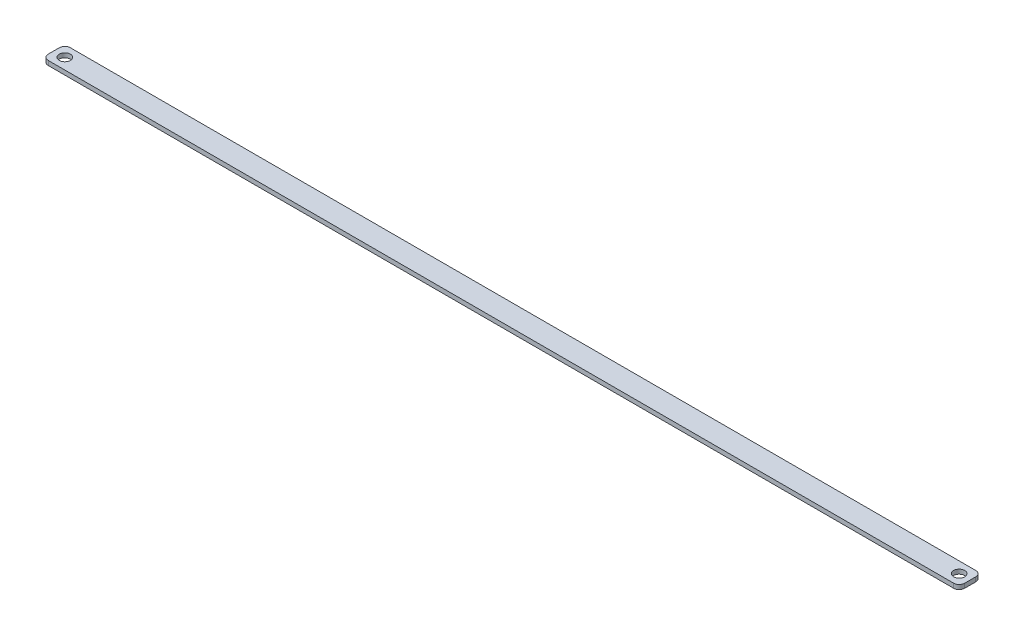
ISO-10303-21;
HEADER;
FILE_DESCRIPTION(('STEP AP214'),'2;1');
FILE_NAME('part.step','',(''),(''),'','','');
FILE_SCHEMA(('AUTOMOTIVE_DESIGN { 1 0 10303 214 1 1 1 1 }'));
ENDSEC;
DATA;
#1=APPLICATION_CONTEXT('core data for automotive mechanical design processes');
#2=APPLICATION_PROTOCOL_DEFINITION('international standard','automotive_design',2000,#1);
#3=PRODUCT_CONTEXT('',#1,'mechanical');
#4=PRODUCT('Part','Part','',(#3));
#5=PRODUCT_RELATED_PRODUCT_CATEGORY('part','',(#4));
#6=PRODUCT_DEFINITION_FORMATION('','',#4);
#7=PRODUCT_DEFINITION_CONTEXT('part definition',#1,'design');
#8=PRODUCT_DEFINITION('design','',#6,#7);
#9=PRODUCT_DEFINITION_SHAPE('','',#8);
#10=(LENGTH_UNIT() NAMED_UNIT(*) SI_UNIT(.MILLI.,.METRE.));
#11=(NAMED_UNIT(*) PLANE_ANGLE_UNIT() SI_UNIT($,.RADIAN.));
#12=(NAMED_UNIT(*) SI_UNIT($,.STERADIAN.) SOLID_ANGLE_UNIT());
#13=UNCERTAINTY_MEASURE_WITH_UNIT(LENGTH_MEASURE(1.E-05),#10,'distance_accuracy_value','');
#14=(GEOMETRIC_REPRESENTATION_CONTEXT(3) GLOBAL_UNCERTAINTY_ASSIGNED_CONTEXT((#13)) GLOBAL_UNIT_ASSIGNED_CONTEXT((#10,
#11,#12)) REPRESENTATION_CONTEXT('',''));
#15=CARTESIAN_POINT('',(0.,0.,0.));
#16=DIRECTION('',(0.,0.,1.));
#17=DIRECTION('',(1.,0.,0.));
#18=AXIS2_PLACEMENT_3D('',#15,#16,#17);
#19=CARTESIAN_POINT('',(231.907336066959,2.,-5.));
#20=DIRECTION('',(0.,-1.,0.));
#21=DIRECTION('',(0.,0.,-1.));
#22=AXIS2_PLACEMENT_3D('',#19,#20,#21);
#23=CYLINDRICAL_SURFACE('',#22,2.5);
#24=CARTESIAN_POINT('',(231.907336066959,0.,-5.));
#25=DIRECTION('',(0.,1.,0.));
#26=DIRECTION('',(0.,0.,1.));
#27=AXIS2_PLACEMENT_3D('',#24,#25,#26);
#28=CIRCLE('',#27,2.5);
#29=CARTESIAN_POINT('',(231.907336066959,0.,-2.5));
#30=VERTEX_POINT('',#29);
#31=EDGE_CURVE('E220',#30,#30,#28,.T.);
#32=ORIENTED_EDGE('',*,*,#31,.F.);
#33=EDGE_LOOP('',(#32));
#34=FACE_BOUND('',#33,.T.);
#35=CARTESIAN_POINT('',(231.907336066959,2.,-5.));
#36=DIRECTION('',(0.,1.,0.));
#37=DIRECTION('',(0.,0.,1.));
#38=AXIS2_PLACEMENT_3D('',#35,#36,#37);
#39=CIRCLE('',#38,2.5);
#40=CARTESIAN_POINT('',(231.907336066959,2.,-2.5));
#41=VERTEX_POINT('',#40);
#42=EDGE_CURVE('E13',#41,#41,#39,.T.);
#43=ORIENTED_EDGE('',*,*,#42,.T.);
#44=EDGE_LOOP('',(#43));
#45=FACE_BOUND('',#44,.T.);
#46=ADVANCED_FACE('F93',(#34,#45),#23,.F.);
#47=CARTESIAN_POINT('',(-173.092663933041,2.,-5.));
#48=DIRECTION('',(0.,-1.,0.));
#49=DIRECTION('',(0.,0.,-1.));
#50=AXIS2_PLACEMENT_3D('',#47,#48,#49);
#51=CYLINDRICAL_SURFACE('',#50,2.5);
#52=CARTESIAN_POINT('',(-173.092663933041,0.,-5.));
#53=DIRECTION('',(0.,1.,0.));
#54=DIRECTION('',(0.,0.,1.));
#55=AXIS2_PLACEMENT_3D('',#52,#53,#54);
#56=CIRCLE('',#55,2.5);
#57=CARTESIAN_POINT('',(-173.092663933041,0.,-2.5));
#58=VERTEX_POINT('',#57);
#59=EDGE_CURVE('E233',#58,#58,#56,.T.);
#60=ORIENTED_EDGE('',*,*,#59,.F.);
#61=EDGE_LOOP('',(#60));
#62=FACE_BOUND('',#61,.T.);
#63=CARTESIAN_POINT('',(-173.092663933041,2.,-5.));
#64=DIRECTION('',(0.,1.,0.));
#65=DIRECTION('',(0.,0.,1.));
#66=AXIS2_PLACEMENT_3D('',#63,#64,#65);
#67=CIRCLE('',#66,2.5);
#68=CARTESIAN_POINT('',(-173.092663933041,2.,-2.5));
#69=VERTEX_POINT('',#68);
#70=EDGE_CURVE('E103',#69,#69,#67,.T.);
#71=ORIENTED_EDGE('',*,*,#70,.T.);
#72=EDGE_LOOP('',(#71));
#73=FACE_BOUND('',#72,.T.);
#74=ADVANCED_FACE('F254',(#62,#73),#51,.F.);
#75=CARTESIAN_POINT('',(47.5,2.,-2.5));
#76=DIRECTION('',(0.,1.,0.));
#77=DIRECTION('',(0.,0.,1.));
#78=AXIS2_PLACEMENT_3D('',#75,#76,#77);
#79=PLANE('',#78);
#80=DIRECTION('',(1.,0.,0.));
#81=VECTOR('',#80,1.);
#82=CARTESIAN_POINT('',(-175.592663933041,2.,0.));
#83=LINE('',#82,#81);
#84=CARTESIAN_POINT('',(-175.592663933041,2.,0.));
#85=VERTEX_POINT('',#84);
#86=CARTESIAN_POINT('',(234.407336066959,2.,0.));
#87=VERTEX_POINT('',#86);
#88=EDGE_CURVE('E156',#85,#87,#83,.T.);
#89=ORIENTED_EDGE('',*,*,#88,.T.);
#90=CARTESIAN_POINT('',(234.407336066959,2.,-2.5));
#91=DIRECTION('',(0.,1.,0.));
#92=DIRECTION('',(0.,0.,1.));
#93=AXIS2_PLACEMENT_3D('',#90,#91,#92);
#94=CIRCLE('',#93,2.5);
#95=CARTESIAN_POINT('',(236.907336066959,2.,-2.50000000000002));
#96=VERTEX_POINT('',#95);
#97=EDGE_CURVE('E162',#87,#96,#94,.T.);
#98=ORIENTED_EDGE('',*,*,#97,.T.);
#99=DIRECTION('',(0.,0.,-1.));
#100=VECTOR('',#99,1.);
#101=CARTESIAN_POINT('',(236.907336066959,2.,-2.50000000000002));
#102=LINE('',#101,#100);
#103=CARTESIAN_POINT('',(236.907336066959,2.,-7.49999999999998));
#104=VERTEX_POINT('',#103);
#105=EDGE_CURVE('E184',#96,#104,#102,.T.);
#106=ORIENTED_EDGE('',*,*,#105,.T.);
#107=CARTESIAN_POINT('',(234.407336066959,2.,-7.5));
#108=DIRECTION('',(0.,1.,0.));
#109=DIRECTION('',(0.,0.,-1.));
#110=AXIS2_PLACEMENT_3D('',#107,#108,#109);
#111=CIRCLE('',#110,2.5);
#112=CARTESIAN_POINT('',(234.407336066959,2.,-10.));
#113=VERTEX_POINT('',#112);
#114=EDGE_CURVE('E188',#104,#113,#111,.T.);
#115=ORIENTED_EDGE('',*,*,#114,.T.);
#116=DIRECTION('',(-1.,0.,0.));
#117=VECTOR('',#116,1.);
#118=CARTESIAN_POINT('',(189.407336066959,2.,-10.));
#119=LINE('',#118,#117);
#120=CARTESIAN_POINT('',(-175.592663933041,2.,-10.));
#121=VERTEX_POINT('',#120);
#122=EDGE_CURVE('E242',#113,#121,#119,.T.);
#123=ORIENTED_EDGE('',*,*,#122,.T.);
#124=CARTESIAN_POINT('',(-175.592663933041,2.,-7.5));
#125=DIRECTION('',(0.,1.,0.));
#126=DIRECTION('',(0.,0.,-1.));
#127=AXIS2_PLACEMENT_3D('',#124,#125,#126);
#128=CIRCLE('',#127,2.5);
#129=CARTESIAN_POINT('',(-178.092663933041,2.,-7.49999999999998));
#130=VERTEX_POINT('',#129);
#131=EDGE_CURVE('E168',#121,#130,#128,.T.);
#132=ORIENTED_EDGE('',*,*,#131,.T.);
#133=DIRECTION('',(0.,0.,1.));
#134=VECTOR('',#133,1.);
#135=CARTESIAN_POINT('',(-178.092663933041,2.,-2.50000000000002));
#136=LINE('',#135,#134);
#137=CARTESIAN_POINT('',(-178.092663933041,2.,-2.50000000000002));
#138=VERTEX_POINT('',#137);
#139=EDGE_CURVE('E186',#130,#138,#136,.T.);
#140=ORIENTED_EDGE('',*,*,#139,.T.);
#141=CARTESIAN_POINT('',(-175.592663933041,2.,-2.5));
#142=DIRECTION('',(0.,1.,0.));
#143=DIRECTION('',(0.,0.,-1.));
#144=AXIS2_PLACEMENT_3D('',#141,#142,#143);
#145=CIRCLE('',#144,2.5);
#146=EDGE_CURVE('E165',#138,#85,#145,.T.);
#147=ORIENTED_EDGE('',*,*,#146,.T.);
#148=EDGE_LOOP('',(#89,#98,#106,#115,#123,#132,#140,#147));
#149=FACE_BOUND('',#148,.T.);
#150=ORIENTED_EDGE('',*,*,#42,.F.);
#151=EDGE_LOOP('',(#150));
#152=FACE_BOUND('',#151,.T.);
#153=ORIENTED_EDGE('',*,*,#70,.F.);
#154=EDGE_LOOP('',(#153));
#155=FACE_BOUND('',#154,.T.);
#156=ADVANCED_FACE('F158',(#149,#152,#155),#79,.T.);
#157=CARTESIAN_POINT('',(234.407336066959,0.,-2.5));
#158=DIRECTION('',(0.,1.,0.));
#159=DIRECTION('',(0.,0.,1.));
#160=AXIS2_PLACEMENT_3D('',#157,#158,#159);
#161=PLANE('',#160);
#162=ORIENTED_EDGE('',*,*,#31,.T.);
#163=EDGE_LOOP('',(#162));
#164=FACE_BOUND('',#163,.T.);
#165=CARTESIAN_POINT('',(234.407336066959,0.,-2.5));
#166=DIRECTION('',(0.,1.,0.));
#167=DIRECTION('',(0.,0.,1.));
#168=AXIS2_PLACEMENT_3D('',#165,#166,#167);
#169=CIRCLE('',#168,2.5);
#170=CARTESIAN_POINT('',(234.407336066959,0.,0.));
#171=VERTEX_POINT('',#170);
#172=CARTESIAN_POINT('',(236.907336066959,0.,-2.50000000000002));
#173=VERTEX_POINT('',#172);
#174=EDGE_CURVE('E177',#171,#173,#169,.T.);
#175=ORIENTED_EDGE('',*,*,#174,.F.);
#176=DIRECTION('',(1.,0.,0.));
#177=VECTOR('',#176,1.);
#178=CARTESIAN_POINT('',(-175.592663933041,0.,0.));
#179=LINE('',#178,#177);
#180=CARTESIAN_POINT('',(-175.592663933041,0.,0.));
#181=VERTEX_POINT('',#180);
#182=EDGE_CURVE('E173',#181,#171,#179,.T.);
#183=ORIENTED_EDGE('',*,*,#182,.F.);
#184=CARTESIAN_POINT('',(-175.592663933041,0.,-2.5));
#185=DIRECTION('',(0.,1.,0.));
#186=DIRECTION('',(0.,0.,-1.));
#187=AXIS2_PLACEMENT_3D('',#184,#185,#186);
#188=CIRCLE('',#187,2.5);
#189=CARTESIAN_POINT('',(-178.092663933041,0.,-2.50000000000002));
#190=VERTEX_POINT('',#189);
#191=EDGE_CURVE('E199',#190,#181,#188,.T.);
#192=ORIENTED_EDGE('',*,*,#191,.F.);
#193=DIRECTION('',(0.,0.,1.));
#194=VECTOR('',#193,1.);
#195=CARTESIAN_POINT('',(-178.092663933041,0.,-2.50000000000002));
#196=LINE('',#195,#194);
#197=CARTESIAN_POINT('',(-178.092663933041,0.,-7.49999999999998));
#198=VERTEX_POINT('',#197);
#199=EDGE_CURVE('E206',#198,#190,#196,.T.);
#200=ORIENTED_EDGE('',*,*,#199,.F.);
#201=CARTESIAN_POINT('',(-175.592663933041,0.,-7.5));
#202=DIRECTION('',(0.,1.,0.));
#203=DIRECTION('',(0.,0.,-1.));
#204=AXIS2_PLACEMENT_3D('',#201,#202,#203);
#205=CIRCLE('',#204,2.5);
#206=CARTESIAN_POINT('',(-175.592663933041,0.,-10.));
#207=VERTEX_POINT('',#206);
#208=EDGE_CURVE('E212',#207,#198,#205,.T.);
#209=ORIENTED_EDGE('',*,*,#208,.F.);
#210=DIRECTION('',(-1.,0.,0.));
#211=VECTOR('',#210,1.);
#212=CARTESIAN_POINT('',(189.407336066959,0.,-10.));
#213=LINE('',#212,#211);
#214=CARTESIAN_POINT('',(234.407336066959,0.,-10.));
#215=VERTEX_POINT('',#214);
#216=EDGE_CURVE('E218',#215,#207,#213,.T.);
#217=ORIENTED_EDGE('',*,*,#216,.F.);
#218=CARTESIAN_POINT('',(234.407336066959,0.,-7.5));
#219=DIRECTION('',(0.,1.,0.));
#220=DIRECTION('',(0.,0.,-1.));
#221=AXIS2_PLACEMENT_3D('',#218,#219,#220);
#222=CIRCLE('',#221,2.5);
#223=CARTESIAN_POINT('',(236.907336066959,0.,-7.49999999999998));
#224=VERTEX_POINT('',#223);
#225=EDGE_CURVE('E223',#224,#215,#222,.T.);
#226=ORIENTED_EDGE('',*,*,#225,.F.);
#227=DIRECTION('',(0.,0.,-1.));
#228=VECTOR('',#227,1.);
#229=CARTESIAN_POINT('',(236.907336066959,0.,-2.50000000000002));
#230=LINE('',#229,#228);
#231=EDGE_CURVE('E178',#173,#224,#230,.T.);
#232=ORIENTED_EDGE('',*,*,#231,.F.);
#233=EDGE_LOOP('',(#175,#183,#192,#200,#209,#217,#226,#232));
#234=FACE_BOUND('',#233,.T.);
#235=ORIENTED_EDGE('',*,*,#59,.T.);
#236=EDGE_LOOP('',(#235));
#237=FACE_BOUND('',#236,.T.);
#238=ADVANCED_FACE('F249',(#164,#234,#237),#161,.F.);
#239=CARTESIAN_POINT('',(189.407336066959,2.,-10.));
#240=DIRECTION('',(0.,0.,1.));
#241=DIRECTION('',(1.,0.,0.));
#242=AXIS2_PLACEMENT_3D('',#239,#240,#241);
#243=PLANE('',#242);
#244=ORIENTED_EDGE('',*,*,#216,.T.);
#245=DIRECTION('',(0.,-1.,0.));
#246=VECTOR('',#245,1.);
#247=CARTESIAN_POINT('',(-175.592663933041,2.,-10.));
#248=LINE('',#247,#246);
#249=EDGE_CURVE('E209',#121,#207,#248,.T.);
#250=ORIENTED_EDGE('',*,*,#249,.F.);
#251=ORIENTED_EDGE('',*,*,#122,.F.);
#252=DIRECTION('',(0.,-1.,0.));
#253=VECTOR('',#252,1.);
#254=CARTESIAN_POINT('',(234.407336066959,2.,-10.));
#255=LINE('',#254,#253);
#256=EDGE_CURVE('E112',#113,#215,#255,.T.);
#257=ORIENTED_EDGE('',*,*,#256,.T.);
#258=EDGE_LOOP('',(#244,#250,#251,#257));
#259=FACE_BOUND('',#258,.T.);
#260=ADVANCED_FACE('F271',(#259),#243,.F.);
#261=CARTESIAN_POINT('',(189.407336066959,2.,0.));
#262=DIRECTION('',(0.,0.,-1.));
#263=DIRECTION('',(-1.,0.,0.));
#264=AXIS2_PLACEMENT_3D('',#261,#262,#263);
#265=PLANE('',#264);
#266=DIRECTION('',(0.,-1.,0.));
#267=VECTOR('',#266,1.);
#268=CARTESIAN_POINT('',(234.407336066959,2.,0.));
#269=LINE('',#268,#267);
#270=EDGE_CURVE('E171',#87,#171,#269,.T.);
#271=ORIENTED_EDGE('',*,*,#270,.F.);
#272=ORIENTED_EDGE('',*,*,#88,.F.);
#273=DIRECTION('',(0.,-1.,0.));
#274=VECTOR('',#273,1.);
#275=CARTESIAN_POINT('',(-175.592663933041,2.,0.));
#276=LINE('',#275,#274);
#277=EDGE_CURVE('E196',#85,#181,#276,.T.);
#278=ORIENTED_EDGE('',*,*,#277,.T.);
#279=ORIENTED_EDGE('',*,*,#182,.T.);
#280=EDGE_LOOP('',(#271,#272,#278,#279));
#281=FACE_BOUND('',#280,.T.);
#282=ADVANCED_FACE('F172',(#281),#265,.F.);
#283=CARTESIAN_POINT('',(234.407336066959,2.,-2.5));
#284=DIRECTION('',(0.,-1.,0.));
#285=DIRECTION('',(0.,0.,-1.));
#286=AXIS2_PLACEMENT_3D('',#283,#284,#285);
#287=CYLINDRICAL_SURFACE('',#286,2.5);
#288=ORIENTED_EDGE('',*,*,#174,.T.);
#289=DIRECTION('',(0.,-1.,0.));
#290=VECTOR('',#289,1.);
#291=CARTESIAN_POINT('',(236.907336066959,2.,-2.50000000000002));
#292=LINE('',#291,#290);
#293=EDGE_CURVE('E182',#96,#173,#292,.T.);
#294=ORIENTED_EDGE('',*,*,#293,.F.);
#295=ORIENTED_EDGE('',*,*,#97,.F.);
#296=ORIENTED_EDGE('',*,*,#270,.T.);
#297=EDGE_LOOP('',(#288,#294,#295,#296));
#298=FACE_BOUND('',#297,.T.);
#299=ADVANCED_FACE('F180',(#298),#287,.T.);
#300=CARTESIAN_POINT('',(236.907336066959,2.,-2.50000000000002));
#301=DIRECTION('',(-1.,0.,0.));
#302=DIRECTION('',(0.,0.,1.));
#303=AXIS2_PLACEMENT_3D('',#300,#301,#302);
#304=PLANE('',#303);
#305=ORIENTED_EDGE('',*,*,#231,.T.);
#306=DIRECTION('',(0.,-1.,0.));
#307=VECTOR('',#306,1.);
#308=CARTESIAN_POINT('',(236.907336066959,2.,-7.49999999999998));
#309=LINE('',#308,#307);
#310=EDGE_CURVE('E215',#104,#224,#309,.T.);
#311=ORIENTED_EDGE('',*,*,#310,.F.);
#312=ORIENTED_EDGE('',*,*,#105,.F.);
#313=ORIENTED_EDGE('',*,*,#293,.T.);
#314=EDGE_LOOP('',(#305,#311,#312,#313));
#315=FACE_BOUND('',#314,.T.);
#316=ADVANCED_FACE('F278',(#315),#304,.F.);
#317=CARTESIAN_POINT('',(234.407336066959,2.,-7.5));
#318=DIRECTION('',(0.,-1.,0.));
#319=DIRECTION('',(0.,0.,-1.));
#320=AXIS2_PLACEMENT_3D('',#317,#318,#319);
#321=CYLINDRICAL_SURFACE('',#320,2.5);
#322=ORIENTED_EDGE('',*,*,#225,.T.);
#323=ORIENTED_EDGE('',*,*,#256,.F.);
#324=ORIENTED_EDGE('',*,*,#114,.F.);
#325=ORIENTED_EDGE('',*,*,#310,.T.);
#326=EDGE_LOOP('',(#322,#323,#324,#325));
#327=FACE_BOUND('',#326,.T.);
#328=ADVANCED_FACE('F281',(#327),#321,.T.);
#329=CARTESIAN_POINT('',(-175.592663933041,2.,-7.5));
#330=DIRECTION('',(0.,-1.,0.));
#331=DIRECTION('',(0.,0.,-1.));
#332=AXIS2_PLACEMENT_3D('',#329,#330,#331);
#333=CYLINDRICAL_SURFACE('',#332,2.5);
#334=ORIENTED_EDGE('',*,*,#208,.T.);
#335=DIRECTION('',(0.,-1.,0.));
#336=VECTOR('',#335,1.);
#337=CARTESIAN_POINT('',(-178.092663933041,2.,-7.49999999999998));
#338=LINE('',#337,#336);
#339=EDGE_CURVE('E202',#130,#198,#338,.T.);
#340=ORIENTED_EDGE('',*,*,#339,.F.);
#341=ORIENTED_EDGE('',*,*,#131,.F.);
#342=ORIENTED_EDGE('',*,*,#249,.T.);
#343=EDGE_LOOP('',(#334,#340,#341,#342));
#344=FACE_BOUND('',#343,.T.);
#345=ADVANCED_FACE('F285',(#344),#333,.T.);
#346=CARTESIAN_POINT('',(-178.092663933041,2.,-2.50000000000002));
#347=DIRECTION('',(1.,0.,0.));
#348=DIRECTION('',(0.,0.,-1.));
#349=AXIS2_PLACEMENT_3D('',#346,#347,#348);
#350=PLANE('',#349);
#351=ORIENTED_EDGE('',*,*,#199,.T.);
#352=DIRECTION('',(0.,-1.,0.));
#353=VECTOR('',#352,1.);
#354=CARTESIAN_POINT('',(-178.092663933041,2.,-2.50000000000002));
#355=LINE('',#354,#353);
#356=EDGE_CURVE('E203',#138,#190,#355,.T.);
#357=ORIENTED_EDGE('',*,*,#356,.F.);
#358=ORIENTED_EDGE('',*,*,#139,.F.);
#359=ORIENTED_EDGE('',*,*,#339,.T.);
#360=EDGE_LOOP('',(#351,#357,#358,#359));
#361=FACE_BOUND('',#360,.T.);
#362=ADVANCED_FACE('F288',(#361),#350,.F.);
#363=CARTESIAN_POINT('',(-175.592663933041,2.,-2.5));
#364=DIRECTION('',(0.,-1.,0.));
#365=DIRECTION('',(0.,0.,-1.));
#366=AXIS2_PLACEMENT_3D('',#363,#364,#365);
#367=CYLINDRICAL_SURFACE('',#366,2.5);
#368=ORIENTED_EDGE('',*,*,#191,.T.);
#369=ORIENTED_EDGE('',*,*,#277,.F.);
#370=ORIENTED_EDGE('',*,*,#146,.F.);
#371=ORIENTED_EDGE('',*,*,#356,.T.);
#372=EDGE_LOOP('',(#368,#369,#370,#371));
#373=FACE_BOUND('',#372,.T.);
#374=ADVANCED_FACE('F95',(#373),#367,.T.);
#375=CLOSED_SHELL('',(#46,#74,#156,#238,#260,#282,#299,#316,#328,#345,#362,#374));
#376=MANIFOLD_SOLID_BREP('B2',#375);
#377=ADVANCED_BREP_SHAPE_REPRESENTATION('',(#18,#376),#14);
#378=SHAPE_DEFINITION_REPRESENTATION(#9,#377);
ENDSEC;
END-ISO-10303-21;
